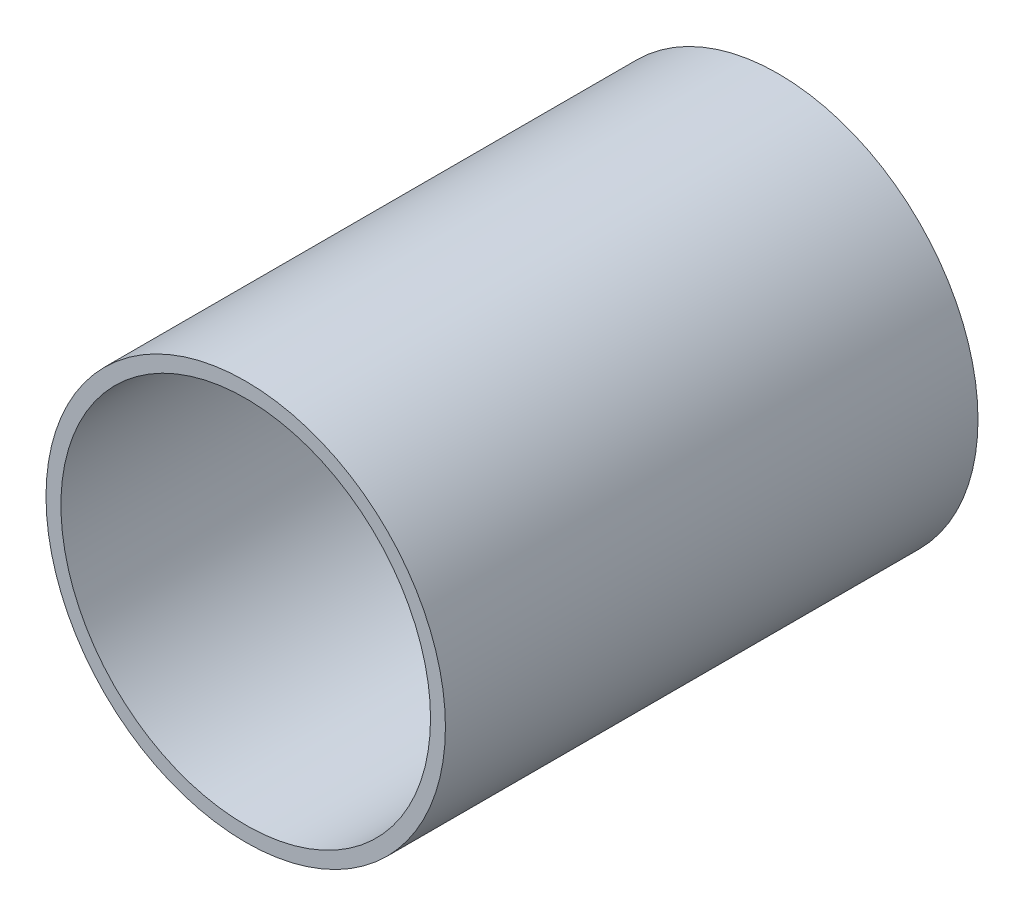
ISO-10303-21;
HEADER;
FILE_DESCRIPTION(('STEP AP214'),'2;1');
FILE_NAME('part.step','',(''),(''),'','','');
FILE_SCHEMA(('AUTOMOTIVE_DESIGN { 1 0 10303 214 1 1 1 1 }'));
ENDSEC;
DATA;
#1=APPLICATION_CONTEXT('core data for automotive mechanical design processes');
#2=APPLICATION_PROTOCOL_DEFINITION('international standard','automotive_design',2000,#1);
#3=PRODUCT_CONTEXT('',#1,'mechanical');
#4=PRODUCT('Part','Part','',(#3));
#5=PRODUCT_RELATED_PRODUCT_CATEGORY('part','',(#4));
#6=PRODUCT_DEFINITION_FORMATION('','',#4);
#7=PRODUCT_DEFINITION_CONTEXT('part definition',#1,'design');
#8=PRODUCT_DEFINITION('design','',#6,#7);
#9=PRODUCT_DEFINITION_SHAPE('','',#8);
#10=(LENGTH_UNIT() NAMED_UNIT(*) SI_UNIT(.MILLI.,.METRE.));
#11=(NAMED_UNIT(*) PLANE_ANGLE_UNIT() SI_UNIT($,.RADIAN.));
#12=(NAMED_UNIT(*) SI_UNIT($,.STERADIAN.) SOLID_ANGLE_UNIT());
#13=UNCERTAINTY_MEASURE_WITH_UNIT(LENGTH_MEASURE(1.E-05),#10,'distance_accuracy_value','');
#14=(GEOMETRIC_REPRESENTATION_CONTEXT(3) GLOBAL_UNCERTAINTY_ASSIGNED_CONTEXT((#13)) GLOBAL_UNIT_ASSIGNED_CONTEXT((#10,
#11,#12)) REPRESENTATION_CONTEXT('',''));
#15=CARTESIAN_POINT('',(0.,0.,0.));
#16=DIRECTION('',(0.,0.,1.));
#17=DIRECTION('',(1.,0.,0.));
#18=AXIS2_PLACEMENT_3D('',#15,#16,#17);
#19=CARTESIAN_POINT('',(0.,0.,25.4));
#20=DIRECTION('',(0.,0.,1.));
#21=DIRECTION('',(1.,0.,0.));
#22=AXIS2_PLACEMENT_3D('',#19,#20,#21);
#23=PLANE('',#22);
#24=CARTESIAN_POINT('',(0.,0.,25.4));
#25=DIRECTION('',(0.,0.,1.));
#26=DIRECTION('',(1.,0.,0.));
#27=AXIS2_PLACEMENT_3D('',#24,#25,#26);
#28=CIRCLE('',#27,9.525);
#29=CARTESIAN_POINT('',(9.52500000000004,0.,25.4));
#30=VERTEX_POINT('',#29);
#31=EDGE_CURVE('E10',#30,#30,#28,.T.);
#32=ORIENTED_EDGE('',*,*,#31,.T.);
#33=EDGE_LOOP('',(#32));
#34=FACE_BOUND('',#33,.T.);
#35=CARTESIAN_POINT('',(0.,0.,25.4));
#36=DIRECTION('',(0.,0.,1.));
#37=DIRECTION('',(1.,0.,0.));
#38=AXIS2_PLACEMENT_3D('',#35,#36,#37);
#39=CIRCLE('',#38,8.8138);
#40=CARTESIAN_POINT('',(8.81380000000003,0.,25.4));
#41=VERTEX_POINT('',#40);
#42=EDGE_CURVE('E39',#41,#41,#39,.T.);
#43=ORIENTED_EDGE('',*,*,#42,.F.);
#44=EDGE_LOOP('',(#43));
#45=FACE_BOUND('',#44,.T.);
#46=ADVANCED_FACE('F28',(#34,#45),#23,.T.);
#47=CARTESIAN_POINT('',(0.,0.,0.));
#48=DIRECTION('',(0.,0.,1.));
#49=DIRECTION('',(1.,0.,0.));
#50=AXIS2_PLACEMENT_3D('',#47,#48,#49);
#51=PLANE('',#50);
#52=CARTESIAN_POINT('',(0.,0.,0.));
#53=DIRECTION('',(0.,0.,1.));
#54=DIRECTION('',(1.,0.,0.));
#55=AXIS2_PLACEMENT_3D('',#52,#53,#54);
#56=CIRCLE('',#55,9.525);
#57=CARTESIAN_POINT('',(9.52500000000003,0.,0.));
#58=VERTEX_POINT('',#57);
#59=EDGE_CURVE('E32',#58,#58,#56,.T.);
#60=ORIENTED_EDGE('',*,*,#59,.F.);
#61=EDGE_LOOP('',(#60));
#62=FACE_BOUND('',#61,.T.);
#63=CARTESIAN_POINT('',(0.,0.,0.));
#64=DIRECTION('',(0.,0.,1.));
#65=DIRECTION('',(1.,0.,0.));
#66=AXIS2_PLACEMENT_3D('',#63,#64,#65);
#67=CIRCLE('',#66,8.8138);
#68=CARTESIAN_POINT('',(8.81380000000002,0.,0.));
#69=VERTEX_POINT('',#68);
#70=EDGE_CURVE('E41',#69,#69,#67,.T.);
#71=ORIENTED_EDGE('',*,*,#70,.T.);
#72=EDGE_LOOP('',(#71));
#73=FACE_BOUND('',#72,.T.);
#74=ADVANCED_FACE('F51',(#62,#73),#51,.F.);
#75=CARTESIAN_POINT('',(0.,0.,25.4));
#76=DIRECTION('',(0.,0.,-1.));
#77=DIRECTION('',(-1.,0.,0.));
#78=AXIS2_PLACEMENT_3D('',#75,#76,#77);
#79=CYLINDRICAL_SURFACE('',#78,9.525);
#80=ORIENTED_EDGE('',*,*,#31,.F.);
#81=EDGE_LOOP('',(#80));
#82=FACE_BOUND('',#81,.T.);
#83=ORIENTED_EDGE('',*,*,#59,.T.);
#84=EDGE_LOOP('',(#83));
#85=FACE_BOUND('',#84,.T.);
#86=ADVANCED_FACE('F30',(#82,#85),#79,.T.);
#87=CARTESIAN_POINT('',(0.,0.,25.4));
#88=DIRECTION('',(0.,0.,-1.));
#89=DIRECTION('',(-1.,0.,0.));
#90=AXIS2_PLACEMENT_3D('',#87,#88,#89);
#91=CYLINDRICAL_SURFACE('',#90,8.8138);
#92=ORIENTED_EDGE('',*,*,#42,.T.);
#93=EDGE_LOOP('',(#92));
#94=FACE_BOUND('',#93,.T.);
#95=ORIENTED_EDGE('',*,*,#70,.F.);
#96=EDGE_LOOP('',(#95));
#97=FACE_BOUND('',#96,.T.);
#98=ADVANCED_FACE('F47',(#94,#97),#91,.F.);
#99=CLOSED_SHELL('',(#46,#74,#86,#98));
#100=MANIFOLD_SOLID_BREP('B2',#99);
#101=ADVANCED_BREP_SHAPE_REPRESENTATION('',(#18,#100),#14);
#102=SHAPE_DEFINITION_REPRESENTATION(#9,#101);
ENDSEC;
END-ISO-10303-21;
